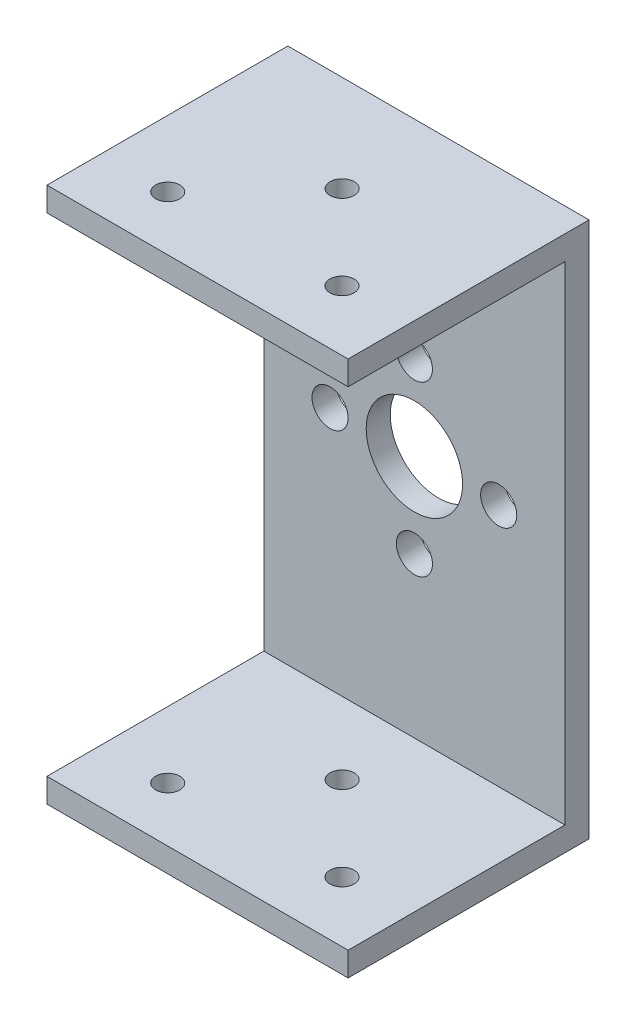
ISO-10303-21;
HEADER;
FILE_DESCRIPTION(('STEP AP214'),'2;1');
FILE_NAME('part.step','',(''),(''),'','','');
FILE_SCHEMA(('AUTOMOTIVE_DESIGN { 1 0 10303 214 1 1 1 1 }'));
ENDSEC;
DATA;
#1=APPLICATION_CONTEXT('core data for automotive mechanical design processes');
#2=APPLICATION_PROTOCOL_DEFINITION('international standard','automotive_design',2000,#1);
#3=PRODUCT_CONTEXT('',#1,'mechanical');
#4=PRODUCT('Part','Part','',(#3));
#5=PRODUCT_RELATED_PRODUCT_CATEGORY('part','',(#4));
#6=PRODUCT_DEFINITION_FORMATION('','',#4);
#7=PRODUCT_DEFINITION_CONTEXT('part definition',#1,'design');
#8=PRODUCT_DEFINITION('design','',#6,#7);
#9=PRODUCT_DEFINITION_SHAPE('','',#8);
#10=(LENGTH_UNIT() NAMED_UNIT(*) SI_UNIT(.MILLI.,.METRE.));
#11=(NAMED_UNIT(*) PLANE_ANGLE_UNIT() SI_UNIT($,.RADIAN.));
#12=(NAMED_UNIT(*) SI_UNIT($,.STERADIAN.) SOLID_ANGLE_UNIT());
#13=UNCERTAINTY_MEASURE_WITH_UNIT(LENGTH_MEASURE(1.E-05),#10,'distance_accuracy_value','');
#14=(GEOMETRIC_REPRESENTATION_CONTEXT(3) GLOBAL_UNCERTAINTY_ASSIGNED_CONTEXT((#13)) GLOBAL_UNIT_ASSIGNED_CONTEXT((#10,
#11,#12)) REPRESENTATION_CONTEXT('',''));
#15=CARTESIAN_POINT('',(0.,0.,0.));
#16=DIRECTION('',(0.,0.,1.));
#17=DIRECTION('',(1.,0.,0.));
#18=AXIS2_PLACEMENT_3D('',#15,#16,#17);
#19=CARTESIAN_POINT('',(-12.6747704507397,30.5029426241211,2.));
#20=DIRECTION('',(1.,0.,0.));
#21=DIRECTION('',(0.,1.,0.));
#22=AXIS2_PLACEMENT_3D('',#19,#20,#21);
#23=PLANE('',#22);
#24=DIRECTION('',(0.,-1.,0.));
#25=VECTOR('',#24,1.);
#26=CARTESIAN_POINT('',(-12.6747704507397,30.5029426241211,0.));
#27=LINE('',#26,#25);
#28=CARTESIAN_POINT('',(-12.6747704507397,32.5029426241211,0.));
#29=VERTEX_POINT('',#28);
#30=CARTESIAN_POINT('',(-12.6747704507397,-11.9970573758789,0.));
#31=VERTEX_POINT('',#30);
#32=EDGE_CURVE('E163',#29,#31,#27,.T.);
#33=ORIENTED_EDGE('',*,*,#32,.T.);
#34=DIRECTION('',(0.,0.,-1.));
#35=VECTOR('',#34,1.);
#36=CARTESIAN_POINT('',(-12.6747704507397,-11.9970573758789,0.));
#37=LINE('',#36,#35);
#38=CARTESIAN_POINT('',(-12.6747704507397,-11.9970573758789,20.));
#39=VERTEX_POINT('',#38);
#40=EDGE_CURVE('E121',#39,#31,#37,.T.);
#41=ORIENTED_EDGE('',*,*,#40,.F.);
#42=DIRECTION('',(0.,1.,0.));
#43=VECTOR('',#42,1.);
#44=CARTESIAN_POINT('',(-12.6747704507397,-11.9970573758789,20.));
#45=LINE('',#44,#43);
#46=CARTESIAN_POINT('',(-12.6747704507397,-9.99705737587891,20.));
#47=VERTEX_POINT('',#46);
#48=EDGE_CURVE('E117',#39,#47,#45,.T.);
#49=ORIENTED_EDGE('',*,*,#48,.T.);
#50=DIRECTION('',(0.,0.,-1.));
#51=VECTOR('',#50,1.);
#52=CARTESIAN_POINT('',(-12.6747704507397,-9.99705737587891,0.));
#53=LINE('',#52,#51);
#54=CARTESIAN_POINT('',(-12.6747704507397,-9.99705737587891,2.));
#55=VERTEX_POINT('',#54);
#56=EDGE_CURVE('E130',#47,#55,#53,.T.);
#57=ORIENTED_EDGE('',*,*,#56,.T.);
#58=DIRECTION('',(0.,-1.,0.));
#59=VECTOR('',#58,1.);
#60=CARTESIAN_POINT('',(-12.6747704507397,30.5029426241211,2.));
#61=LINE('',#60,#59);
#62=CARTESIAN_POINT('',(-12.6747704507397,30.5029426241211,2.));
#63=VERTEX_POINT('',#62);
#64=EDGE_CURVE('E155',#63,#55,#61,.T.);
#65=ORIENTED_EDGE('',*,*,#64,.F.);
#66=DIRECTION('',(0.,0.,1.));
#67=VECTOR('',#66,1.);
#68=CARTESIAN_POINT('',(-12.6747704507397,30.5029426241211,0.));
#69=LINE('',#68,#67);
#70=CARTESIAN_POINT('',(-12.6747704507397,30.5029426241211,20.));
#71=VERTEX_POINT('',#70);
#72=EDGE_CURVE('E62',#63,#71,#69,.T.);
#73=ORIENTED_EDGE('',*,*,#72,.T.);
#74=DIRECTION('',(0.,-1.,0.));
#75=VECTOR('',#74,1.);
#76=CARTESIAN_POINT('',(-12.6747704507397,32.5029426241211,20.));
#77=LINE('',#76,#75);
#78=CARTESIAN_POINT('',(-12.6747704507397,32.5029426241211,20.));
#79=VERTEX_POINT('',#78);
#80=EDGE_CURVE('E180',#79,#71,#77,.T.);
#81=ORIENTED_EDGE('',*,*,#80,.F.);
#82=DIRECTION('',(0.,0.,1.));
#83=VECTOR('',#82,1.);
#84=CARTESIAN_POINT('',(-12.6747704507397,32.5029426241211,0.));
#85=LINE('',#84,#83);
#86=EDGE_CURVE('E198',#29,#79,#85,.T.);
#87=ORIENTED_EDGE('',*,*,#86,.F.);
#88=EDGE_LOOP('',(#33,#41,#49,#57,#65,#73,#81,#87));
#89=FACE_BOUND('',#88,.T.);
#90=ADVANCED_FACE('F46',(#89),#23,.F.);
#91=CARTESIAN_POINT('',(12.3252295492603,30.5029426241211,2.));
#92=DIRECTION('',(-1.,0.,0.));
#93=DIRECTION('',(0.,-1.,0.));
#94=AXIS2_PLACEMENT_3D('',#91,#92,#93);
#95=PLANE('',#94);
#96=DIRECTION('',(0.,1.,0.));
#97=VECTOR('',#96,1.);
#98=CARTESIAN_POINT('',(12.3252295492603,30.5029426241211,0.));
#99=LINE('',#98,#97);
#100=CARTESIAN_POINT('',(12.3252295492603,-11.9970573758789,0.));
#101=VERTEX_POINT('',#100);
#102=CARTESIAN_POINT('',(12.3252295492603,32.5029426241211,0.));
#103=VERTEX_POINT('',#102);
#104=EDGE_CURVE('E160',#101,#103,#99,.T.);
#105=ORIENTED_EDGE('',*,*,#104,.T.);
#106=DIRECTION('',(0.,0.,-1.));
#107=VECTOR('',#106,1.);
#108=CARTESIAN_POINT('',(12.3252295492603,32.5029426241211,0.));
#109=LINE('',#108,#107);
#110=CARTESIAN_POINT('',(12.3252295492603,32.5029426241211,20.));
#111=VERTEX_POINT('',#110);
#112=EDGE_CURVE('E204',#111,#103,#109,.T.);
#113=ORIENTED_EDGE('',*,*,#112,.F.);
#114=DIRECTION('',(0.,-1.,0.));
#115=VECTOR('',#114,1.);
#116=CARTESIAN_POINT('',(12.3252295492603,32.5029426241211,20.));
#117=LINE('',#116,#115);
#118=CARTESIAN_POINT('',(12.3252295492603,30.5029426241211,20.));
#119=VERTEX_POINT('',#118);
#120=EDGE_CURVE('E183',#111,#119,#117,.T.);
#121=ORIENTED_EDGE('',*,*,#120,.T.);
#122=DIRECTION('',(0.,0.,-1.));
#123=VECTOR('',#122,1.);
#124=CARTESIAN_POINT('',(12.3252295492603,30.5029426241211,0.));
#125=LINE('',#124,#123);
#126=CARTESIAN_POINT('',(12.3252295492603,30.5029426241211,2.));
#127=VERTEX_POINT('',#126);
#128=EDGE_CURVE('E176',#119,#127,#125,.T.);
#129=ORIENTED_EDGE('',*,*,#128,.T.);
#130=DIRECTION('',(0.,1.,0.));
#131=VECTOR('',#130,1.);
#132=CARTESIAN_POINT('',(12.3252295492603,30.5029426241211,2.));
#133=LINE('',#132,#131);
#134=CARTESIAN_POINT('',(12.3252295492603,-9.99705737587891,2.));
#135=VERTEX_POINT('',#134);
#136=EDGE_CURVE('E54',#135,#127,#133,.T.);
#137=ORIENTED_EDGE('',*,*,#136,.F.);
#138=DIRECTION('',(0.,0.,1.));
#139=VECTOR('',#138,1.);
#140=CARTESIAN_POINT('',(12.3252295492603,-9.99705737587891,0.));
#141=LINE('',#140,#139);
#142=CARTESIAN_POINT('',(12.3252295492603,-9.99705737587891,20.));
#143=VERTEX_POINT('',#142);
#144=EDGE_CURVE('E69',#135,#143,#141,.T.);
#145=ORIENTED_EDGE('',*,*,#144,.T.);
#146=DIRECTION('',(0.,1.,0.));
#147=VECTOR('',#146,1.);
#148=CARTESIAN_POINT('',(12.3252295492603,-11.9970573758789,20.));
#149=LINE('',#148,#147);
#150=CARTESIAN_POINT('',(12.3252295492603,-11.9970573758789,20.));
#151=VERTEX_POINT('',#150);
#152=EDGE_CURVE('E115',#151,#143,#149,.T.);
#153=ORIENTED_EDGE('',*,*,#152,.F.);
#154=DIRECTION('',(0.,0.,1.));
#155=VECTOR('',#154,1.);
#156=CARTESIAN_POINT('',(12.3252295492603,-11.9970573758789,0.));
#157=LINE('',#156,#155);
#158=EDGE_CURVE('E122',#101,#151,#157,.T.);
#159=ORIENTED_EDGE('',*,*,#158,.F.);
#160=EDGE_LOOP('',(#105,#113,#121,#129,#137,#145,#153,#159));
#161=FACE_BOUND('',#160,.T.);
#162=ADVANCED_FACE('F132',(#161),#95,.F.);
#163=CARTESIAN_POINT('',(0.,0.,2.));
#164=DIRECTION('',(0.,0.,1.));
#165=DIRECTION('',(1.,0.,0.));
#166=AXIS2_PLACEMENT_3D('',#163,#164,#165);
#167=PLANE('',#166);
#168=CARTESIAN_POINT('',(-0.174770450739726,17.2529426241211,2.));
#169=DIRECTION('',(0.,0.,1.));
#170=DIRECTION('',(1.,0.,0.));
#171=AXIS2_PLACEMENT_3D('',#168,#169,#170);
#172=CIRCLE('',#171,1.5);
#173=CARTESIAN_POINT('',(1.32522954926027,17.2529426241211,2.));
#174=VERTEX_POINT('',#173);
#175=EDGE_CURVE('E391',#174,#174,#172,.T.);
#176=ORIENTED_EDGE('',*,*,#175,.F.);
#177=EDGE_LOOP('',(#176));
#178=FACE_BOUND('',#177,.T.);
#179=CARTESIAN_POINT('',(6.82522954926027,10.2529426241211,2.));
#180=DIRECTION('',(0.,0.,1.));
#181=DIRECTION('',(1.,0.,0.));
#182=AXIS2_PLACEMENT_3D('',#179,#180,#181);
#183=CIRCLE('',#182,1.5);
#184=CARTESIAN_POINT('',(8.32522954926027,10.2529426241211,2.));
#185=VERTEX_POINT('',#184);
#186=EDGE_CURVE('E385',#185,#185,#183,.T.);
#187=ORIENTED_EDGE('',*,*,#186,.F.);
#188=EDGE_LOOP('',(#187));
#189=FACE_BOUND('',#188,.T.);
#190=CARTESIAN_POINT('',(-0.174770450739726,3.25294262412109,2.));
#191=DIRECTION('',(0.,0.,1.));
#192=DIRECTION('',(1.,0.,0.));
#193=AXIS2_PLACEMENT_3D('',#190,#191,#192);
#194=CIRCLE('',#193,1.5);
#195=CARTESIAN_POINT('',(1.32522954926027,3.25294262412109,2.));
#196=VERTEX_POINT('',#195);
#197=EDGE_CURVE('E379',#196,#196,#194,.T.);
#198=ORIENTED_EDGE('',*,*,#197,.F.);
#199=EDGE_LOOP('',(#198));
#200=FACE_BOUND('',#199,.T.);
#201=CARTESIAN_POINT('',(-7.17477045073973,10.2529426241211,2.));
#202=DIRECTION('',(0.,0.,1.));
#203=DIRECTION('',(1.,0.,0.));
#204=AXIS2_PLACEMENT_3D('',#201,#202,#203);
#205=CIRCLE('',#204,1.5);
#206=CARTESIAN_POINT('',(-5.67477045073973,10.2529426241211,2.));
#207=VERTEX_POINT('',#206);
#208=EDGE_CURVE('E370',#207,#207,#205,.T.);
#209=ORIENTED_EDGE('',*,*,#208,.F.);
#210=EDGE_LOOP('',(#209));
#211=FACE_BOUND('',#210,.T.);
#212=CARTESIAN_POINT('',(-0.174770450739726,10.2529426241211,2.));
#213=DIRECTION('',(0.,0.,1.));
#214=DIRECTION('',(1.,0.,0.));
#215=AXIS2_PLACEMENT_3D('',#212,#213,#214);
#216=CIRCLE('',#215,4.);
#217=CARTESIAN_POINT('',(3.82522954926027,10.2529426241211,2.));
#218=VERTEX_POINT('',#217);
#219=EDGE_CURVE('E143',#218,#218,#216,.T.);
#220=ORIENTED_EDGE('',*,*,#219,.F.);
#221=EDGE_LOOP('',(#220));
#222=FACE_BOUND('',#221,.T.);
#223=ORIENTED_EDGE('',*,*,#64,.T.);
#224=DIRECTION('',(1.,0.,0.));
#225=VECTOR('',#224,1.);
#226=CARTESIAN_POINT('',(-12.6747704507397,-9.99705737587891,2.));
#227=LINE('',#226,#225);
#228=EDGE_CURVE('E159',#55,#135,#227,.T.);
#229=ORIENTED_EDGE('',*,*,#228,.T.);
#230=ORIENTED_EDGE('',*,*,#136,.T.);
#231=DIRECTION('',(-1.,0.,0.));
#232=VECTOR('',#231,1.);
#233=CARTESIAN_POINT('',(-12.6747704507397,30.5029426241211,2.));
#234=LINE('',#233,#232);
#235=EDGE_CURVE('E13',#127,#63,#234,.T.);
#236=ORIENTED_EDGE('',*,*,#235,.T.);
#237=EDGE_LOOP('',(#223,#229,#230,#236));
#238=FACE_BOUND('',#237,.T.);
#239=ADVANCED_FACE('F157',(#178,#189,#200,#211,#222,#238),#167,.T.);
#240=CARTESIAN_POINT('',(0.,0.,0.));
#241=DIRECTION('',(0.,0.,1.));
#242=DIRECTION('',(1.,0.,0.));
#243=AXIS2_PLACEMENT_3D('',#240,#241,#242);
#244=PLANE('',#243);
#245=CARTESIAN_POINT('',(-0.174770450739726,17.2529426241211,0.));
#246=DIRECTION('',(0.,0.,-1.));
#247=DIRECTION('',(-1.,0.,0.));
#248=AXIS2_PLACEMENT_3D('',#245,#246,#247);
#249=CIRCLE('',#248,1.5);
#250=CARTESIAN_POINT('',(-1.67477045073973,17.2529426241211,0.));
#251=VERTEX_POINT('',#250);
#252=EDGE_CURVE('E394',#251,#251,#249,.T.);
#253=ORIENTED_EDGE('',*,*,#252,.F.);
#254=EDGE_LOOP('',(#253));
#255=FACE_BOUND('',#254,.T.);
#256=CARTESIAN_POINT('',(6.82522954926027,10.2529426241211,0.));
#257=DIRECTION('',(0.,0.,-1.));
#258=DIRECTION('',(-1.,0.,0.));
#259=AXIS2_PLACEMENT_3D('',#256,#257,#258);
#260=CIRCLE('',#259,1.5);
#261=CARTESIAN_POINT('',(5.32522954926027,10.2529426241211,0.));
#262=VERTEX_POINT('',#261);
#263=EDGE_CURVE('E388',#262,#262,#260,.T.);
#264=ORIENTED_EDGE('',*,*,#263,.F.);
#265=EDGE_LOOP('',(#264));
#266=FACE_BOUND('',#265,.T.);
#267=CARTESIAN_POINT('',(-0.174770450739726,3.25294262412109,0.));
#268=DIRECTION('',(0.,0.,-1.));
#269=DIRECTION('',(-1.,0.,0.));
#270=AXIS2_PLACEMENT_3D('',#267,#268,#269);
#271=CIRCLE('',#270,1.5);
#272=CARTESIAN_POINT('',(-1.67477045073973,3.25294262412109,0.));
#273=VERTEX_POINT('',#272);
#274=EDGE_CURVE('E382',#273,#273,#271,.T.);
#275=ORIENTED_EDGE('',*,*,#274,.F.);
#276=EDGE_LOOP('',(#275));
#277=FACE_BOUND('',#276,.T.);
#278=CARTESIAN_POINT('',(-7.17477045073973,10.2529426241211,0.));
#279=DIRECTION('',(0.,0.,-1.));
#280=DIRECTION('',(-1.,0.,0.));
#281=AXIS2_PLACEMENT_3D('',#278,#279,#280);
#282=CIRCLE('',#281,1.5);
#283=CARTESIAN_POINT('',(-8.67477045073973,10.2529426241211,0.));
#284=VERTEX_POINT('',#283);
#285=EDGE_CURVE('E374',#284,#284,#282,.T.);
#286=ORIENTED_EDGE('',*,*,#285,.F.);
#287=EDGE_LOOP('',(#286));
#288=FACE_BOUND('',#287,.T.);
#289=CARTESIAN_POINT('',(-0.174770450739726,10.2529426241211,0.));
#290=DIRECTION('',(0.,0.,-1.));
#291=DIRECTION('',(-1.,0.,0.));
#292=AXIS2_PLACEMENT_3D('',#289,#290,#291);
#293=CIRCLE('',#292,4.);
#294=CARTESIAN_POINT('',(-4.17477045073973,10.2529426241211,0.));
#295=VERTEX_POINT('',#294);
#296=EDGE_CURVE('E368',#295,#295,#293,.T.);
#297=ORIENTED_EDGE('',*,*,#296,.F.);
#298=EDGE_LOOP('',(#297));
#299=FACE_BOUND('',#298,.T.);
#300=ORIENTED_EDGE('',*,*,#32,.F.);
#301=DIRECTION('',(-1.,0.,0.));
#302=VECTOR('',#301,1.);
#303=CARTESIAN_POINT('',(-12.6747704507397,32.5029426241211,0.));
#304=LINE('',#303,#302);
#305=EDGE_CURVE('E188',#103,#29,#304,.T.);
#306=ORIENTED_EDGE('',*,*,#305,.F.);
#307=ORIENTED_EDGE('',*,*,#104,.F.);
#308=DIRECTION('',(1.,0.,0.));
#309=VECTOR('',#308,1.);
#310=CARTESIAN_POINT('',(12.3252295492603,-11.9970573758789,0.));
#311=LINE('',#310,#309);
#312=EDGE_CURVE('E128',#31,#101,#311,.T.);
#313=ORIENTED_EDGE('',*,*,#312,.F.);
#314=EDGE_LOOP('',(#300,#306,#307,#313));
#315=FACE_BOUND('',#314,.T.);
#316=ADVANCED_FACE('F233',(#255,#266,#277,#288,#299,#315),#244,.F.);
#317=CARTESIAN_POINT('',(-12.6747704507397,32.5029426241211,20.));
#318=DIRECTION('',(0.,0.,-1.));
#319=DIRECTION('',(-1.,0.,0.));
#320=AXIS2_PLACEMENT_3D('',#317,#318,#319);
#321=PLANE('',#320);
#322=DIRECTION('',(1.,0.,0.));
#323=VECTOR('',#322,1.);
#324=CARTESIAN_POINT('',(-12.6747704507397,30.5029426241211,20.));
#325=LINE('',#324,#323);
#326=EDGE_CURVE('E135',#71,#119,#325,.T.);
#327=ORIENTED_EDGE('',*,*,#326,.T.);
#328=ORIENTED_EDGE('',*,*,#120,.F.);
#329=DIRECTION('',(1.,0.,0.));
#330=VECTOR('',#329,1.);
#331=CARTESIAN_POINT('',(-12.6747704507397,32.5029426241211,20.));
#332=LINE('',#331,#330);
#333=EDGE_CURVE('E201',#79,#111,#332,.T.);
#334=ORIENTED_EDGE('',*,*,#333,.F.);
#335=ORIENTED_EDGE('',*,*,#80,.T.);
#336=EDGE_LOOP('',(#327,#328,#334,#335));
#337=FACE_BOUND('',#336,.T.);
#338=ADVANCED_FACE('F220',(#337),#321,.F.);
#339=CARTESIAN_POINT('',(0.,32.5029426241211,0.));
#340=DIRECTION('',(0.,1.,0.));
#341=DIRECTION('',(0.,0.,1.));
#342=AXIS2_PLACEMENT_3D('',#339,#340,#341);
#343=PLANE('',#342);
#344=CARTESIAN_POINT('',(-0.174770450739721,32.5029426241211,8.));
#345=DIRECTION('',(0.,1.,0.));
#346=DIRECTION('',(0.,0.,1.));
#347=AXIS2_PLACEMENT_3D('',#344,#345,#346);
#348=CIRCLE('',#347,1.);
#349=CARTESIAN_POINT('',(-0.174770450739721,32.5029426241211,9.));
#350=VERTEX_POINT('',#349);
#351=EDGE_CURVE('E416',#350,#350,#348,.T.);
#352=ORIENTED_EDGE('',*,*,#351,.F.);
#353=EDGE_LOOP('',(#352));
#354=FACE_BOUND('',#353,.T.);
#355=CARTESIAN_POINT('',(6.81723010464083,32.5029426241211,15.));
#356=DIRECTION('',(0.,1.,0.));
#357=DIRECTION('',(0.,0.,1.));
#358=AXIS2_PLACEMENT_3D('',#355,#356,#357);
#359=CIRCLE('',#358,1.);
#360=CARTESIAN_POINT('',(6.81723010464083,32.5029426241211,16.));
#361=VERTEX_POINT('',#360);
#362=EDGE_CURVE('E406',#361,#361,#359,.T.);
#363=ORIENTED_EDGE('',*,*,#362,.F.);
#364=EDGE_LOOP('',(#363));
#365=FACE_BOUND('',#364,.T.);
#366=CARTESIAN_POINT('',(-7.17477045073972,32.5029426241211,15.4732023438555));
#367=DIRECTION('',(0.,1.,0.));
#368=DIRECTION('',(0.,0.,1.));
#369=AXIS2_PLACEMENT_3D('',#366,#367,#368);
#370=CIRCLE('',#369,1.);
#371=CARTESIAN_POINT('',(-7.17477045073972,32.5029426241211,16.4732023438555));
#372=VERTEX_POINT('',#371);
#373=EDGE_CURVE('E397',#372,#372,#370,.T.);
#374=ORIENTED_EDGE('',*,*,#373,.F.);
#375=EDGE_LOOP('',(#374));
#376=FACE_BOUND('',#375,.T.);
#377=ORIENTED_EDGE('',*,*,#86,.T.);
#378=ORIENTED_EDGE('',*,*,#333,.T.);
#379=ORIENTED_EDGE('',*,*,#112,.T.);
#380=ORIENTED_EDGE('',*,*,#305,.T.);
#381=EDGE_LOOP('',(#377,#378,#379,#380));
#382=FACE_BOUND('',#381,.T.);
#383=ADVANCED_FACE('F209',(#354,#365,#376,#382),#343,.T.);
#384=CARTESIAN_POINT('',(0.,30.5029426241211,0.));
#385=DIRECTION('',(0.,1.,0.));
#386=DIRECTION('',(0.,0.,1.));
#387=AXIS2_PLACEMENT_3D('',#384,#385,#386);
#388=PLANE('',#387);
#389=CARTESIAN_POINT('',(-0.174770450739721,30.5029426241211,8.));
#390=DIRECTION('',(0.,1.,0.));
#391=DIRECTION('',(0.,0.,1.));
#392=AXIS2_PLACEMENT_3D('',#389,#390,#391);
#393=CIRCLE('',#392,1.);
#394=CARTESIAN_POINT('',(-0.174770450739721,30.5029426241211,9.));
#395=VERTEX_POINT('',#394);
#396=EDGE_CURVE('E418',#395,#395,#393,.T.);
#397=ORIENTED_EDGE('',*,*,#396,.T.);
#398=EDGE_LOOP('',(#397));
#399=FACE_BOUND('',#398,.T.);
#400=CARTESIAN_POINT('',(6.81723010464083,30.5029426241211,15.));
#401=DIRECTION('',(0.,1.,0.));
#402=DIRECTION('',(0.,0.,1.));
#403=AXIS2_PLACEMENT_3D('',#400,#401,#402);
#404=CIRCLE('',#403,1.);
#405=CARTESIAN_POINT('',(6.81723010464083,30.5029426241211,16.));
#406=VERTEX_POINT('',#405);
#407=EDGE_CURVE('E409',#406,#406,#404,.T.);
#408=ORIENTED_EDGE('',*,*,#407,.T.);
#409=EDGE_LOOP('',(#408));
#410=FACE_BOUND('',#409,.T.);
#411=CARTESIAN_POINT('',(-7.17477045073972,30.5029426241211,15.4732023438555));
#412=DIRECTION('',(0.,1.,0.));
#413=DIRECTION('',(0.,0.,1.));
#414=AXIS2_PLACEMENT_3D('',#411,#412,#413);
#415=CIRCLE('',#414,1.);
#416=CARTESIAN_POINT('',(-7.17477045073972,30.5029426241211,16.4732023438555));
#417=VERTEX_POINT('',#416);
#418=EDGE_CURVE('E400',#417,#417,#415,.T.);
#419=ORIENTED_EDGE('',*,*,#418,.T.);
#420=EDGE_LOOP('',(#419));
#421=FACE_BOUND('',#420,.T.);
#422=ORIENTED_EDGE('',*,*,#235,.F.);
#423=ORIENTED_EDGE('',*,*,#128,.F.);
#424=ORIENTED_EDGE('',*,*,#326,.F.);
#425=ORIENTED_EDGE('',*,*,#72,.F.);
#426=EDGE_LOOP('',(#422,#423,#424,#425));
#427=FACE_BOUND('',#426,.T.);
#428=ADVANCED_FACE('F211',(#399,#410,#421,#427),#388,.F.);
#429=CARTESIAN_POINT('',(12.3252295492603,-11.9970573758789,20.));
#430=DIRECTION('',(0.,0.,-1.));
#431=DIRECTION('',(-1.,0.,0.));
#432=AXIS2_PLACEMENT_3D('',#429,#430,#431);
#433=PLANE('',#432);
#434=DIRECTION('',(-1.,0.,0.));
#435=VECTOR('',#434,1.);
#436=CARTESIAN_POINT('',(12.3252295492603,-9.99705737587891,20.));
#437=LINE('',#436,#435);
#438=EDGE_CURVE('E142',#143,#47,#437,.T.);
#439=ORIENTED_EDGE('',*,*,#438,.T.);
#440=ORIENTED_EDGE('',*,*,#48,.F.);
#441=DIRECTION('',(-1.,0.,0.));
#442=VECTOR('',#441,1.);
#443=CARTESIAN_POINT('',(12.3252295492603,-11.9970573758789,20.));
#444=LINE('',#443,#442);
#445=EDGE_CURVE('E111',#151,#39,#444,.T.);
#446=ORIENTED_EDGE('',*,*,#445,.F.);
#447=ORIENTED_EDGE('',*,*,#152,.T.);
#448=EDGE_LOOP('',(#439,#440,#446,#447));
#449=FACE_BOUND('',#448,.T.);
#450=ADVANCED_FACE('F113',(#449),#433,.F.);
#451=CARTESIAN_POINT('',(0.,-11.9970573758789,0.));
#452=DIRECTION('',(0.,-1.,0.));
#453=DIRECTION('',(0.,0.,-1.));
#454=AXIS2_PLACEMENT_3D('',#451,#452,#453);
#455=PLANE('',#454);
#456=CARTESIAN_POINT('',(-0.174770450739721,-11.9970573758789,8.));
#457=DIRECTION('',(0.,-1.,0.));
#458=DIRECTION('',(0.,0.,-1.));
#459=AXIS2_PLACEMENT_3D('',#456,#457,#458);
#460=CIRCLE('',#459,1.);
#461=CARTESIAN_POINT('',(-0.174770450739721,-11.9970573758789,7.));
#462=VERTEX_POINT('',#461);
#463=EDGE_CURVE('E420',#462,#462,#460,.T.);
#464=ORIENTED_EDGE('',*,*,#463,.F.);
#465=EDGE_LOOP('',(#464));
#466=FACE_BOUND('',#465,.T.);
#467=CARTESIAN_POINT('',(6.81723010464083,-11.9970573758789,15.));
#468=DIRECTION('',(0.,-1.,0.));
#469=DIRECTION('',(0.,0.,-1.));
#470=AXIS2_PLACEMENT_3D('',#467,#468,#469);
#471=CIRCLE('',#470,1.);
#472=CARTESIAN_POINT('',(6.81723010464083,-11.9970573758789,14.));
#473=VERTEX_POINT('',#472);
#474=EDGE_CURVE('E413',#473,#473,#471,.T.);
#475=ORIENTED_EDGE('',*,*,#474,.F.);
#476=EDGE_LOOP('',(#475));
#477=FACE_BOUND('',#476,.T.);
#478=CARTESIAN_POINT('',(-7.17477045073972,-11.9970573758789,15.4732023438555));
#479=DIRECTION('',(0.,-1.,0.));
#480=DIRECTION('',(0.,0.,-1.));
#481=AXIS2_PLACEMENT_3D('',#478,#479,#480);
#482=CIRCLE('',#481,1.);
#483=CARTESIAN_POINT('',(-7.17477045073972,-11.9970573758789,14.4732023438555));
#484=VERTEX_POINT('',#483);
#485=EDGE_CURVE('E403',#484,#484,#482,.T.);
#486=ORIENTED_EDGE('',*,*,#485,.F.);
#487=EDGE_LOOP('',(#486));
#488=FACE_BOUND('',#487,.T.);
#489=ORIENTED_EDGE('',*,*,#158,.T.);
#490=ORIENTED_EDGE('',*,*,#445,.T.);
#491=ORIENTED_EDGE('',*,*,#40,.T.);
#492=ORIENTED_EDGE('',*,*,#312,.T.);
#493=EDGE_LOOP('',(#489,#490,#491,#492));
#494=FACE_BOUND('',#493,.T.);
#495=ADVANCED_FACE('F126',(#466,#477,#488,#494),#455,.T.);
#496=CARTESIAN_POINT('',(0.,-9.99705737587891,0.));
#497=DIRECTION('',(0.,-1.,0.));
#498=DIRECTION('',(0.,0.,-1.));
#499=AXIS2_PLACEMENT_3D('',#496,#497,#498);
#500=PLANE('',#499);
#501=CARTESIAN_POINT('',(-0.174770450739721,-9.99705737587892,8.));
#502=DIRECTION('',(0.,-1.,0.));
#503=DIRECTION('',(0.,0.,-1.));
#504=AXIS2_PLACEMENT_3D('',#501,#502,#503);
#505=CIRCLE('',#504,1.);
#506=CARTESIAN_POINT('',(-0.174770450739721,-9.99705737587892,7.));
#507=VERTEX_POINT('',#506);
#508=EDGE_CURVE('E49',#507,#507,#505,.T.);
#509=ORIENTED_EDGE('',*,*,#508,.T.);
#510=EDGE_LOOP('',(#509));
#511=FACE_BOUND('',#510,.T.);
#512=CARTESIAN_POINT('',(6.81723010464083,-9.99705737587892,15.));
#513=DIRECTION('',(0.,-1.,0.));
#514=DIRECTION('',(0.,0.,-1.));
#515=AXIS2_PLACEMENT_3D('',#512,#513,#514);
#516=CIRCLE('',#515,1.);
#517=CARTESIAN_POINT('',(6.81723010464083,-9.99705737587892,14.));
#518=VERTEX_POINT('',#517);
#519=EDGE_CURVE('E412',#518,#518,#516,.T.);
#520=ORIENTED_EDGE('',*,*,#519,.T.);
#521=EDGE_LOOP('',(#520));
#522=FACE_BOUND('',#521,.T.);
#523=CARTESIAN_POINT('',(-7.17477045073972,-9.99705737587892,15.4732023438555));
#524=DIRECTION('',(0.,-1.,0.));
#525=DIRECTION('',(0.,0.,-1.));
#526=AXIS2_PLACEMENT_3D('',#523,#524,#525);
#527=CIRCLE('',#526,1.);
#528=CARTESIAN_POINT('',(-7.17477045073972,-9.99705737587892,14.4732023438555));
#529=VERTEX_POINT('',#528);
#530=EDGE_CURVE('E173',#529,#529,#527,.T.);
#531=ORIENTED_EDGE('',*,*,#530,.T.);
#532=EDGE_LOOP('',(#531));
#533=FACE_BOUND('',#532,.T.);
#534=ORIENTED_EDGE('',*,*,#228,.F.);
#535=ORIENTED_EDGE('',*,*,#56,.F.);
#536=ORIENTED_EDGE('',*,*,#438,.F.);
#537=ORIENTED_EDGE('',*,*,#144,.F.);
#538=EDGE_LOOP('',(#534,#535,#536,#537));
#539=FACE_BOUND('',#538,.T.);
#540=ADVANCED_FACE('F268',(#511,#522,#533,#539),#500,.F.);
#541=CARTESIAN_POINT('',(-0.174770450739726,10.2529426241211,21.));
#542=DIRECTION('',(0.,0.,-1.));
#543=DIRECTION('',(-1.,0.,0.));
#544=AXIS2_PLACEMENT_3D('',#541,#542,#543);
#545=CYLINDRICAL_SURFACE('',#544,4.);
#546=ORIENTED_EDGE('',*,*,#219,.T.);
#547=EDGE_LOOP('',(#546));
#548=FACE_BOUND('',#547,.T.);
#549=ORIENTED_EDGE('',*,*,#296,.T.);
#550=EDGE_LOOP('',(#549));
#551=FACE_BOUND('',#550,.T.);
#552=ADVANCED_FACE('F279',(#548,#551),#545,.F.);
#553=CARTESIAN_POINT('',(-7.17477045073973,10.2529426241211,21.));
#554=DIRECTION('',(0.,0.,-1.));
#555=DIRECTION('',(-1.,0.,0.));
#556=AXIS2_PLACEMENT_3D('',#553,#554,#555);
#557=CYLINDRICAL_SURFACE('',#556,1.5);
#558=ORIENTED_EDGE('',*,*,#208,.T.);
#559=EDGE_LOOP('',(#558));
#560=FACE_BOUND('',#559,.T.);
#561=ORIENTED_EDGE('',*,*,#285,.T.);
#562=EDGE_LOOP('',(#561));
#563=FACE_BOUND('',#562,.T.);
#564=ADVANCED_FACE('F355',(#560,#563),#557,.F.);
#565=CARTESIAN_POINT('',(-0.174770450739726,3.25294262412109,21.));
#566=DIRECTION('',(0.,0.,-1.));
#567=DIRECTION('',(-1.,0.,0.));
#568=AXIS2_PLACEMENT_3D('',#565,#566,#567);
#569=CYLINDRICAL_SURFACE('',#568,1.5);
#570=ORIENTED_EDGE('',*,*,#197,.T.);
#571=EDGE_LOOP('',(#570));
#572=FACE_BOUND('',#571,.T.);
#573=ORIENTED_EDGE('',*,*,#274,.T.);
#574=EDGE_LOOP('',(#573));
#575=FACE_BOUND('',#574,.T.);
#576=ADVANCED_FACE('F351',(#572,#575),#569,.F.);
#577=CARTESIAN_POINT('',(6.82522954926027,10.2529426241211,21.));
#578=DIRECTION('',(0.,0.,-1.));
#579=DIRECTION('',(-1.,0.,0.));
#580=AXIS2_PLACEMENT_3D('',#577,#578,#579);
#581=CYLINDRICAL_SURFACE('',#580,1.5);
#582=ORIENTED_EDGE('',*,*,#186,.T.);
#583=EDGE_LOOP('',(#582));
#584=FACE_BOUND('',#583,.T.);
#585=ORIENTED_EDGE('',*,*,#263,.T.);
#586=EDGE_LOOP('',(#585));
#587=FACE_BOUND('',#586,.T.);
#588=ADVANCED_FACE('F347',(#584,#587),#581,.F.);
#589=CARTESIAN_POINT('',(-0.174770450739726,17.2529426241211,21.));
#590=DIRECTION('',(0.,0.,-1.));
#591=DIRECTION('',(-1.,0.,0.));
#592=AXIS2_PLACEMENT_3D('',#589,#590,#591);
#593=CYLINDRICAL_SURFACE('',#592,1.5);
#594=ORIENTED_EDGE('',*,*,#175,.T.);
#595=EDGE_LOOP('',(#594));
#596=FACE_BOUND('',#595,.T.);
#597=ORIENTED_EDGE('',*,*,#252,.T.);
#598=EDGE_LOOP('',(#597));
#599=FACE_BOUND('',#598,.T.);
#600=ADVANCED_FACE('F254',(#596,#599),#593,.F.);
#601=CARTESIAN_POINT('',(-7.17477045073972,43.0029426241211,15.4732023438555));
#602=DIRECTION('',(0.,-1.,0.));
#603=DIRECTION('',(0.,0.,-1.));
#604=AXIS2_PLACEMENT_3D('',#601,#602,#603);
#605=CYLINDRICAL_SURFACE('',#604,1.);
#606=ORIENTED_EDGE('',*,*,#485,.T.);
#607=EDGE_LOOP('',(#606));
#608=FACE_BOUND('',#607,.T.);
#609=ORIENTED_EDGE('',*,*,#530,.F.);
#610=EDGE_LOOP('',(#609));
#611=FACE_BOUND('',#610,.T.);
#612=ADVANCED_FACE('F287',(#608,#611),#605,.F.);
#613=ORIENTED_EDGE('',*,*,#373,.T.);
#614=EDGE_LOOP('',(#613));
#615=FACE_BOUND('',#614,.T.);
#616=ORIENTED_EDGE('',*,*,#418,.F.);
#617=EDGE_LOOP('',(#616));
#618=FACE_BOUND('',#617,.T.);
#619=ADVANCED_FACE('F292',(#615,#618),#605,.F.);
#620=CARTESIAN_POINT('',(6.81723010464083,43.0029426241211,15.));
#621=DIRECTION('',(0.,-1.,0.));
#622=DIRECTION('',(0.,0.,-1.));
#623=AXIS2_PLACEMENT_3D('',#620,#621,#622);
#624=CYLINDRICAL_SURFACE('',#623,1.);
#625=ORIENTED_EDGE('',*,*,#474,.T.);
#626=EDGE_LOOP('',(#625));
#627=FACE_BOUND('',#626,.T.);
#628=ORIENTED_EDGE('',*,*,#519,.F.);
#629=EDGE_LOOP('',(#628));
#630=FACE_BOUND('',#629,.T.);
#631=ADVANCED_FACE('F302',(#627,#630),#624,.F.);
#632=ORIENTED_EDGE('',*,*,#362,.T.);
#633=EDGE_LOOP('',(#632));
#634=FACE_BOUND('',#633,.T.);
#635=ORIENTED_EDGE('',*,*,#407,.F.);
#636=EDGE_LOOP('',(#635));
#637=FACE_BOUND('',#636,.T.);
#638=ADVANCED_FACE('F311',(#634,#637),#624,.F.);
#639=CARTESIAN_POINT('',(-0.174770450739721,43.0029426241211,8.));
#640=DIRECTION('',(0.,-1.,0.));
#641=DIRECTION('',(0.,0.,-1.));
#642=AXIS2_PLACEMENT_3D('',#639,#640,#641);
#643=CYLINDRICAL_SURFACE('',#642,1.);
#644=ORIENTED_EDGE('',*,*,#463,.T.);
#645=EDGE_LOOP('',(#644));
#646=FACE_BOUND('',#645,.T.);
#647=ORIENTED_EDGE('',*,*,#508,.F.);
#648=EDGE_LOOP('',(#647));
#649=FACE_BOUND('',#648,.T.);
#650=ADVANCED_FACE('F321',(#646,#649),#643,.F.);
#651=ORIENTED_EDGE('',*,*,#351,.T.);
#652=EDGE_LOOP('',(#651));
#653=FACE_BOUND('',#652,.T.);
#654=ORIENTED_EDGE('',*,*,#396,.F.);
#655=EDGE_LOOP('',(#654));
#656=FACE_BOUND('',#655,.T.);
#657=ADVANCED_FACE('F330',(#653,#656),#643,.F.);
#658=CLOSED_SHELL('',(#90,#162,#239,#316,#338,#383,#428,#450,#495,#540,#552,#564,#576,#588,#600,
#612,#619,#631,#638,#650,#657));
#659=MANIFOLD_SOLID_BREP('B2',#658);
#660=ADVANCED_BREP_SHAPE_REPRESENTATION('',(#18,#659),#14);
#661=SHAPE_DEFINITION_REPRESENTATION(#9,#660);
ENDSEC;
END-ISO-10303-21;
